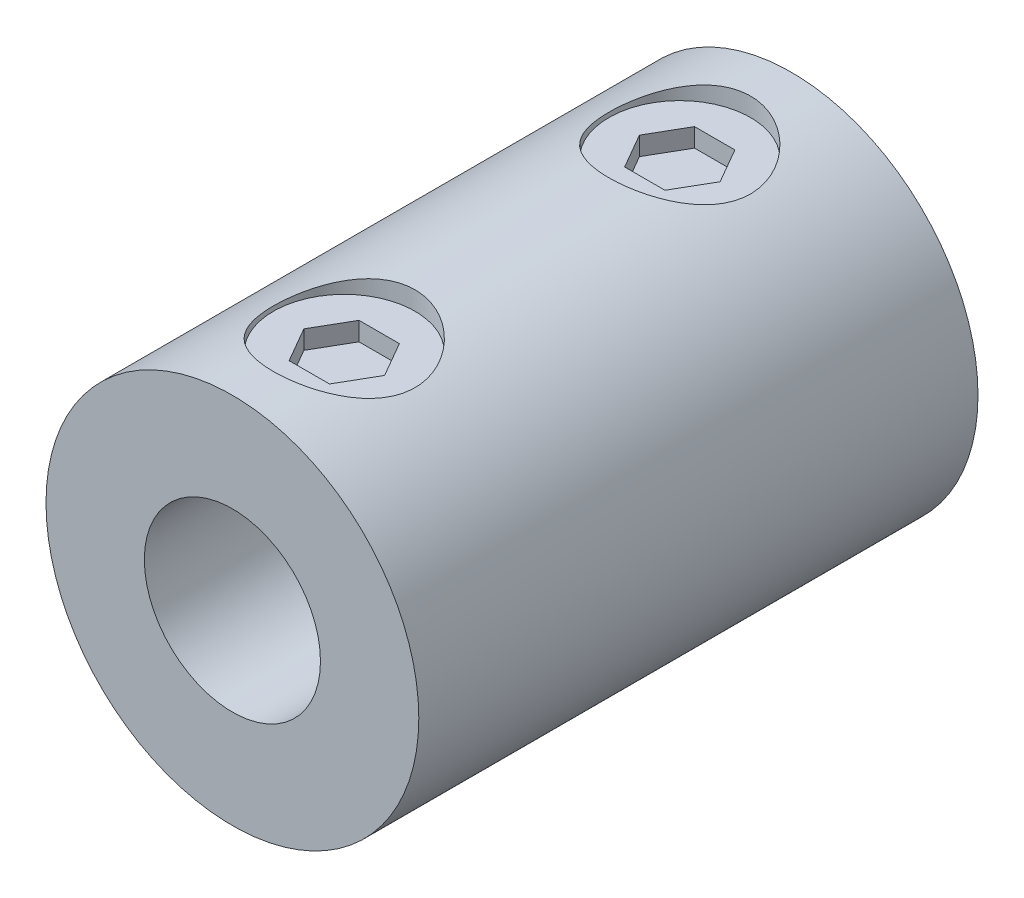
ISO-10303-21;
HEADER;
FILE_DESCRIPTION(('STEP AP214'),'2;1');
FILE_NAME('part.step','',(''),(''),'','','');
FILE_SCHEMA(('AUTOMOTIVE_DESIGN { 1 0 10303 214 1 1 1 1 }'));
ENDSEC;
DATA;
#1=APPLICATION_CONTEXT('core data for automotive mechanical design processes');
#2=APPLICATION_PROTOCOL_DEFINITION('international standard','automotive_design',2000,#1);
#3=PRODUCT_CONTEXT('',#1,'mechanical');
#4=PRODUCT('Part','Part','',(#3));
#5=PRODUCT_RELATED_PRODUCT_CATEGORY('part','',(#4));
#6=PRODUCT_DEFINITION_FORMATION('','',#4);
#7=PRODUCT_DEFINITION_CONTEXT('part definition',#1,'design');
#8=PRODUCT_DEFINITION('design','',#6,#7);
#9=PRODUCT_DEFINITION_SHAPE('','',#8);
#10=(LENGTH_UNIT() NAMED_UNIT(*) SI_UNIT(.MILLI.,.METRE.));
#11=(NAMED_UNIT(*) PLANE_ANGLE_UNIT() SI_UNIT($,.RADIAN.));
#12=(NAMED_UNIT(*) SI_UNIT($,.STERADIAN.) SOLID_ANGLE_UNIT());
#13=UNCERTAINTY_MEASURE_WITH_UNIT(LENGTH_MEASURE(1.E-05),#10,'distance_accuracy_value','');
#14=(GEOMETRIC_REPRESENTATION_CONTEXT(3) GLOBAL_UNCERTAINTY_ASSIGNED_CONTEXT((#13)) GLOBAL_UNIT_ASSIGNED_CONTEXT((#10,
#11,#12)) REPRESENTATION_CONTEXT('',''));
#15=CARTESIAN_POINT('',(0.,0.,0.));
#16=DIRECTION('',(0.,0.,1.));
#17=DIRECTION('',(1.,0.,0.));
#18=AXIS2_PLACEMENT_3D('',#15,#16,#17);
#19=CARTESIAN_POINT('',(0.,0.,0.));
#20=DIRECTION('',(0.,0.,1.));
#21=DIRECTION('',(1.,0.,0.));
#22=AXIS2_PLACEMENT_3D('',#19,#20,#21);
#23=CYLINDRICAL_SURFACE('',#22,6.35);
#24=CARTESIAN_POINT('',(0.,6.35,-1.397));
#25=CARTESIAN_POINT('',(-0.130555931467962,6.35000398969011,-1.39699472465397));
#26=CARTESIAN_POINT('',(-0.261076241377739,6.34593890816647,-1.40762854568869));
#27=CARTESIAN_POINT('',(-0.518209446534913,6.33012963929965,-1.44970520323576));
#28=CARTESIAN_POINT('',(-0.644823015088655,6.31838678300935,-1.48114443284222));
#29=CARTESIAN_POINT('',(-0.890396734122701,6.28848040494,-1.56355488397925));
#30=CARTESIAN_POINT('',(-1.00937135935963,6.27032947705095,-1.61448781061553));
#31=CARTESIAN_POINT('',(-1.23707694907279,6.22940932060409,-1.73424235438065));
#32=CARTESIAN_POINT('',(-1.34580507871092,6.20663881943741,-1.80306890235231));
#33=CARTESIAN_POINT('',(-1.55465440906211,6.15771932779737,-1.95977722907386));
#34=CARTESIAN_POINT('',(-1.65427192875035,6.13147296383124,-2.04829958375005));
#35=CARTESIAN_POINT('',(-1.83765571561736,6.07903240405007,-2.24052684957095));
#36=CARTESIAN_POINT('',(-1.92141693988139,6.05283822744466,-2.34423657234878));
#37=CARTESIAN_POINT('',(-2.07395660623912,6.00232668170519,-2.56886613529876));
#38=CARTESIAN_POINT('',(-2.14201618015845,5.97812365120729,-2.69030243845216));
#39=CARTESIAN_POINT('',(-2.25652093858858,5.93585432476053,-2.94396161956764));
#40=CARTESIAN_POINT('',(-2.30297502037546,5.91778550353544,-3.07618003097919));
#41=CARTESIAN_POINT('',(-2.37094947712185,5.89087364983883,-3.34184636810197));
#42=CARTESIAN_POINT('',(-2.39343294050412,5.88167580744491,-3.47501069920451));
#43=CARTESIAN_POINT('',(-2.41583880524757,5.87251090464605,-3.74351540370638));
#44=CARTESIAN_POINT('',(-2.41577084821779,5.87253989940926,-3.87885482242323));
#45=CARTESIAN_POINT('',(-2.39381090108878,5.88152011871453,-4.13897222700301));
#46=CARTESIAN_POINT('',(-2.37326609797153,5.88992057372023,-4.26388652256324));
#47=CARTESIAN_POINT('',(-2.31316652422954,5.91378008823147,-4.50833970499082));
#48=CARTESIAN_POINT('',(-2.27360881167116,5.92924024008996,-4.6278777568419));
#49=CARTESIAN_POINT('',(-2.17588364092748,5.96580146890692,-4.86089161528519));
#50=CARTESIAN_POINT('',(-2.11737290423755,5.98700531598431,-4.97420661484106));
#51=CARTESIAN_POINT('',(-1.98364217411329,6.03263175509447,-5.18979639920587));
#52=CARTESIAN_POINT('',(-1.90841630395244,6.05705547794376,-5.29206728227269));
#53=CARTESIAN_POINT('',(-1.73726689770536,6.10842961274997,-5.49010694238863));
#54=CARTESIAN_POINT('',(-1.64027173491613,6.13543795015635,-5.58493688260015));
#55=CARTESIAN_POINT('',(-1.43144868882472,6.18748920351012,-5.75726806056401));
#56=CARTESIAN_POINT('',(-1.31961840653187,6.2125318005324,-5.83476649017818));
#57=CARTESIAN_POINT('',(-1.08185265975391,6.25835188225341,-5.97130771487283));
#58=CARTESIAN_POINT('',(-0.955717417234619,6.27905339803369,-6.03002994310971));
#59=CARTESIAN_POINT('',(-0.694375189035109,6.31329326294077,-6.12510736575225));
#60=CARTESIAN_POINT('',(-0.559172376611222,6.32683488218724,-6.1614727723643));
#61=CARTESIAN_POINT('',(-0.291428150212526,6.3446501972992,-6.20898109857718));
#62=CARTESIAN_POINT('',(-0.159141645079809,6.34938771868047,-6.22138775288999));
#63=CARTESIAN_POINT('',(0.105693065348275,6.35049981057155,-6.22431626348442));
#64=CARTESIAN_POINT('',(0.238241203822051,6.34687629478166,-6.21484312768025));
#65=CARTESIAN_POINT('',(0.494323602805378,6.33197908606406,-6.17523562382545));
#66=CARTESIAN_POINT('',(0.61800684441211,6.32101461634214,-6.14593589818825));
#67=CARTESIAN_POINT('',(0.858609565436108,6.29285092848222,-6.06861304376362));
#68=CARTESIAN_POINT('',(0.975528163914414,6.27565090041604,-6.02058748264172));
#69=CARTESIAN_POINT('',(1.20317276582384,6.23607457125026,-5.90563503714011));
#70=CARTESIAN_POINT('',(1.3136121499673,6.21355984396609,-5.8381896761049));
#71=CARTESIAN_POINT('',(1.52197988578177,6.16583504517286,-5.68689595883598));
#72=CARTESIAN_POINT('',(1.61990351002366,6.14062396176678,-5.60304143465584));
#73=CARTESIAN_POINT('',(1.80656807112922,6.08841217199752,-5.41543272496061));
#74=CARTESIAN_POINT('',(1.89441393314817,6.06139435477813,-5.3107904098217));
#75=CARTESIAN_POINT('',(2.05148411432654,6.01005496187559,-5.08772800811267));
#76=CARTESIAN_POINT('',(2.12070651399853,5.98573366426972,-4.96930650314625));
#77=CARTESIAN_POINT('',(2.23870023772464,5.94261798623814,-4.7209227485386));
#78=CARTESIAN_POINT('',(2.28736466342468,5.92385264334907,-4.59090433202338));
#79=CARTESIAN_POINT('',(2.36177800946808,5.89458517077402,-4.32360269433198));
#80=CARTESIAN_POINT('',(2.38754162954713,5.8840777409413,-4.18632419336358));
#81=CARTESIAN_POINT('',(2.41408994040532,5.87323215610138,-3.91812716521538));
#82=CARTESIAN_POINT('',(2.41640623148607,5.87227054588007,-3.78738426561589));
#83=CARTESIAN_POINT('',(2.3999373204655,5.8790202253426,-3.52747512660344));
#84=CARTESIAN_POINT('',(2.38115423316032,5.88673064582665,-3.39830873048875));
#85=CARTESIAN_POINT('',(2.32422421188573,5.90943043237583,-3.14944773415065));
#86=CARTESIAN_POINT('',(2.28672002796391,5.92417751295514,-3.02958208050832));
#87=CARTESIAN_POINT('',(2.193985281894,5.95914188552999,-2.79777854381398));
#88=CARTESIAN_POINT('',(2.13875018285588,5.97936057736355,-2.68584269875618));
#89=CARTESIAN_POINT('',(2.00869997639504,6.02433337271119,-2.46657199424197));
#90=CARTESIAN_POINT('',(1.93299650808672,6.04927206356278,-2.3598023758283));
#91=CARTESIAN_POINT('',(1.76551836882646,6.10025417003155,-2.15999380632773));
#92=CARTESIAN_POINT('',(1.67373852090438,6.12629793945648,-2.06695929610574));
#93=CARTESIAN_POINT('',(1.47055494697206,6.17831294001547,-1.89192790048063));
#94=CARTESIAN_POINT('',(1.35833856072122,6.20419794006484,-1.81084443358628));
#95=CARTESIAN_POINT('',(1.12096041375387,6.25144642675378,-1.66870237925231));
#96=CARTESIAN_POINT('',(0.995797050693126,6.27280935273315,-1.60764627434948));
#97=CARTESIAN_POINT('',(0.728778395788013,6.30955475572144,-1.50500736383774));
#98=CARTESIAN_POINT('',(0.586384697783372,6.32454657619378,-1.4646711947635));
#99=CARTESIAN_POINT('',(0.295976705251579,6.34476431329028,-1.41067767117735));
#100=CARTESIAN_POINT('',(0.147965475024478,6.34999547828747,-1.39700597880979));
#101=CARTESIAN_POINT('',(0.,6.35,-1.397));
#102=B_SPLINE_CURVE_WITH_KNOTS('',3,(#24,#25,#26,#27,#28,#29,#30,#31,#32,#33,#34,#35,#36,#37,
#38,#39,#40,#41,#42,#43,#44,#45,#46,#47,#48,#49,#50,#51,#52,#53,#54,#55,#56,#57,#58,#59,#60,#61,
#62,#63,#64,#65,#66,#67,#68,#69,#70,#71,#72,#73,#74,#75,#76,#77,#78,#79,#80,#81,#82,#83,#84,#85,
#86,#87,#88,#89,#90,#91,#92,#93,#94,#95,#96,#97,#98,#99,#100,#101),.UNSPECIFIED.,.T.,.F.,(4,2,2,
2,2,2,2,2,2,2,2,2,2,2,2,2,2,2,2,2,2,2,2,2,2,2,2,2,2,2,2,2,2,2,2,2,2,2,4),(0.,0.391121887064184,
0.782175985486185,1.17246577830223,1.56286323524963,1.96854634212709,2.37435825594016,
2.79613130529395,3.21773051175688,3.62166628723491,4.02542936468621,4.40427313209371,
4.78317553819666,5.16936515238192,5.55569075901495,5.96873424705113,6.38184461005431,
6.80167192308662,7.22130732355893,7.61812936188613,8.01486058335589,8.39585156202365,
8.77689204483065,9.16923685275,9.56172942118013,9.9776135359701,10.3935404987953,
10.8116043631128,11.2293996833676,11.6197130905881,12.0099873800853,12.3876994067832,
12.7655081575183,13.1635000328781,13.5616203073396,13.9821012344605,14.4026342635628,
14.8461505355472,15.2894282569131),.UNSPECIFIED.);
#103=CARTESIAN_POINT('',(0.,6.35,-1.397));
#104=VERTEX_POINT('',#103);
#105=EDGE_CURVE('E251',#104,#104,#102,.T.);
#106=ORIENTED_EDGE('',*,*,#105,.T.);
#107=EDGE_LOOP('',(#106));
#108=FACE_BOUND('',#107,.T.);
#109=CARTESIAN_POINT('',(0.,0.,0.));
#110=DIRECTION('',(0.,0.,1.));
#111=DIRECTION('',(1.,0.,0.));
#112=AXIS2_PLACEMENT_3D('',#109,#110,#111);
#113=CIRCLE('',#112,6.35);
#114=CARTESIAN_POINT('',(6.35,0.,0.));
#115=VERTEX_POINT('',#114);
#116=EDGE_CURVE('E245',#115,#115,#113,.T.);
#117=ORIENTED_EDGE('',*,*,#116,.F.);
#118=EDGE_LOOP('',(#117));
#119=FACE_BOUND('',#118,.T.);
#120=CARTESIAN_POINT('',(0.,0.,-19.05));
#121=DIRECTION('',(0.,0.,1.));
#122=DIRECTION('',(1.,0.,0.));
#123=AXIS2_PLACEMENT_3D('',#120,#121,#122);
#124=CIRCLE('',#123,6.35);
#125=CARTESIAN_POINT('',(6.35,0.,-19.05));
#126=VERTEX_POINT('',#125);
#127=EDGE_CURVE('E242',#126,#126,#124,.T.);
#128=ORIENTED_EDGE('',*,*,#127,.T.);
#129=EDGE_LOOP('',(#128));
#130=FACE_BOUND('',#129,.T.);
#131=CARTESIAN_POINT('',(0.,6.35,-12.827));
#132=CARTESIAN_POINT('',(0.130555931467962,6.35000398969011,-12.826994724654));
#133=CARTESIAN_POINT('',(0.261076241377739,6.34593890816647,-12.8376285456887));
#134=CARTESIAN_POINT('',(0.518209446534913,6.33012963929965,-12.8797052032358));
#135=CARTESIAN_POINT('',(0.644823015088655,6.31838678300935,-12.9111444328422));
#136=CARTESIAN_POINT('',(0.890396734122701,6.28848040494,-12.9935548839793));
#137=CARTESIAN_POINT('',(1.00937135935963,6.27032947705095,-13.0444878106155));
#138=CARTESIAN_POINT('',(1.23707694907279,6.22940932060409,-13.1642423543807));
#139=CARTESIAN_POINT('',(1.34580507871092,6.20663881943741,-13.2330689023523));
#140=CARTESIAN_POINT('',(1.55465440906211,6.15771932779737,-13.3897772290739));
#141=CARTESIAN_POINT('',(1.65427192875035,6.13147296383124,-13.4782995837501));
#142=CARTESIAN_POINT('',(1.83765571561736,6.07903240405007,-13.670526849571));
#143=CARTESIAN_POINT('',(1.92141693988139,6.05283822744466,-13.7742365723488));
#144=CARTESIAN_POINT('',(2.07395660623911,6.00232668170519,-13.9988661352988));
#145=CARTESIAN_POINT('',(2.14201618015845,5.97812365120729,-14.1203024384522));
#146=CARTESIAN_POINT('',(2.25652093858858,5.93585432476053,-14.3739616195676));
#147=CARTESIAN_POINT('',(2.30297502037546,5.91778550353544,-14.5061800309792));
#148=CARTESIAN_POINT('',(2.37094947712185,5.89087364983883,-14.771846368102));
#149=CARTESIAN_POINT('',(2.39343294050412,5.88167580744491,-14.9050106992045));
#150=CARTESIAN_POINT('',(2.41583880524757,5.87251090464605,-15.1735154037064));
#151=CARTESIAN_POINT('',(2.41577084821779,5.87253989940926,-15.3088548224232));
#152=CARTESIAN_POINT('',(2.39381090108878,5.88152011871453,-15.568972227003));
#153=CARTESIAN_POINT('',(2.37326609797153,5.88992057372023,-15.6938865225632));
#154=CARTESIAN_POINT('',(2.31316652422954,5.91378008823147,-15.9383397049908));
#155=CARTESIAN_POINT('',(2.27360881167116,5.92924024008996,-16.0578777568419));
#156=CARTESIAN_POINT('',(2.17588364092748,5.96580146890692,-16.2908916152852));
#157=CARTESIAN_POINT('',(2.11737290423754,5.98700531598431,-16.4042066148411));
#158=CARTESIAN_POINT('',(1.98364217411328,6.03263175509448,-16.6197963992059));
#159=CARTESIAN_POINT('',(1.90841630395244,6.05705547794376,-16.7220672822727));
#160=CARTESIAN_POINT('',(1.73726689770536,6.10842961274997,-16.9201069423886));
#161=CARTESIAN_POINT('',(1.64027173491613,6.13543795015635,-17.0149368826002));
#162=CARTESIAN_POINT('',(1.43144868882472,6.18748920351011,-17.187268060564));
#163=CARTESIAN_POINT('',(1.31961840653187,6.2125318005324,-17.2647664901782));
#164=CARTESIAN_POINT('',(1.08185265975391,6.25835188225341,-17.4013077148728));
#165=CARTESIAN_POINT('',(0.95571741723462,6.27905339803369,-17.4600299431097));
#166=CARTESIAN_POINT('',(0.69437518903511,6.31329326294077,-17.5551073657523));
#167=CARTESIAN_POINT('',(0.559172376611222,6.32683488218724,-17.5914727723643));
#168=CARTESIAN_POINT('',(0.291428150212526,6.3446501972992,-17.6389810985772));
#169=CARTESIAN_POINT('',(0.159141645079809,6.34938771868047,-17.65138775289));
#170=CARTESIAN_POINT('',(-0.105693065348275,6.35049981057155,-17.6543162634844));
#171=CARTESIAN_POINT('',(-0.238241203822051,6.34687629478166,-17.6448431276803));
#172=CARTESIAN_POINT('',(-0.494323602805378,6.33197908606406,-17.6052356238255));
#173=CARTESIAN_POINT('',(-0.61800684441211,6.32101461634214,-17.5759358981883));
#174=CARTESIAN_POINT('',(-0.858609565436108,6.29285092848222,-17.4986130437636));
#175=CARTESIAN_POINT('',(-0.975528163914414,6.27565090041604,-17.4505874826417));
#176=CARTESIAN_POINT('',(-1.20317276582384,6.23607457125026,-17.3356350371401));
#177=CARTESIAN_POINT('',(-1.3136121499673,6.21355984396609,-17.2681896761049));
#178=CARTESIAN_POINT('',(-1.52197988578177,6.16583504517286,-17.116895958836));
#179=CARTESIAN_POINT('',(-1.61990351002366,6.14062396176678,-17.0330414346558));
#180=CARTESIAN_POINT('',(-1.80656807112922,6.08841217199752,-16.8454327249606));
#181=CARTESIAN_POINT('',(-1.89441393314817,6.06139435477813,-16.7407904098217));
#182=CARTESIAN_POINT('',(-2.05148411432654,6.01005496187559,-16.5177280081127));
#183=CARTESIAN_POINT('',(-2.12070651399853,5.98573366426972,-16.3993065031462));
#184=CARTESIAN_POINT('',(-2.23870023772464,5.94261798623814,-16.1509227485386));
#185=CARTESIAN_POINT('',(-2.28736466342468,5.92385264334907,-16.0209043320234));
#186=CARTESIAN_POINT('',(-2.36177800946809,5.89458517077402,-15.753602694332));
#187=CARTESIAN_POINT('',(-2.38754162954713,5.8840777409413,-15.6163241933636));
#188=CARTESIAN_POINT('',(-2.41408994040532,5.87323215610138,-15.3481271652154));
#189=CARTESIAN_POINT('',(-2.41640623148607,5.87227054588007,-15.2173842656159));
#190=CARTESIAN_POINT('',(-2.3999373204655,5.8790202253426,-14.9574751266034));
#191=CARTESIAN_POINT('',(-2.38115423316032,5.88673064582665,-14.8283087304887));
#192=CARTESIAN_POINT('',(-2.32422421188573,5.90943043237583,-14.5794477341507));
#193=CARTESIAN_POINT('',(-2.28672002796391,5.92417751295514,-14.4595820805083));
#194=CARTESIAN_POINT('',(-2.19398528189399,5.95914188552999,-14.227778543814));
#195=CARTESIAN_POINT('',(-2.13875018285588,5.97936057736356,-14.1158426987562));
#196=CARTESIAN_POINT('',(-2.00869997639504,6.02433337271119,-13.896571994242));
#197=CARTESIAN_POINT('',(-1.93299650808671,6.04927206356278,-13.7898023758283));
#198=CARTESIAN_POINT('',(-1.76551836882646,6.10025417003155,-13.5899938063277));
#199=CARTESIAN_POINT('',(-1.67373852090438,6.12629793945648,-13.4969592961057));
#200=CARTESIAN_POINT('',(-1.47055494697206,6.17831294001547,-13.3219279004806));
#201=CARTESIAN_POINT('',(-1.35833856072122,6.20419794006484,-13.2408444335863));
#202=CARTESIAN_POINT('',(-1.12096041375387,6.25144642675378,-13.0987023792523));
#203=CARTESIAN_POINT('',(-0.995797050693125,6.27280935273315,-13.0376462743495));
#204=CARTESIAN_POINT('',(-0.728778395788011,6.30955475572144,-12.9350073638377));
#205=CARTESIAN_POINT('',(-0.58638469778337,6.32454657619378,-12.8946711947635));
#206=CARTESIAN_POINT('',(-0.295976705251577,6.34476431329028,-12.8406776711774));
#207=CARTESIAN_POINT('',(-0.147965475024477,6.34999547828747,-12.8270059788098));
#208=CARTESIAN_POINT('',(0.,6.35,-12.827));
#209=B_SPLINE_CURVE_WITH_KNOTS('',3,(#131,#132,#133,#134,#135,#136,#137,#138,#139,#140,#141,
#142,#143,#144,#145,#146,#147,#148,#149,#150,#151,#152,#153,#154,#155,#156,#157,#158,#159,#160,
#161,#162,#163,#164,#165,#166,#167,#168,#169,#170,#171,#172,#173,#174,#175,#176,#177,#178,#179,
#180,#181,#182,#183,#184,#185,#186,#187,#188,#189,#190,#191,#192,#193,#194,#195,#196,#197,#198,
#199,#200,#201,#202,#203,#204,#205,#206,#207,#208),.UNSPECIFIED.,.T.,.F.,(4,2,2,2,2,2,2,2,2,2,2,
2,2,2,2,2,2,2,2,2,2,2,2,2,2,2,2,2,2,2,2,2,2,2,2,2,2,2,4),(0.,0.391121887064184,
0.782175985486185,1.17246577830223,1.56286323524963,1.96854634212709,2.37435825594016,
2.79613130529395,3.21773051175688,3.62166628723491,4.02542936468621,4.40427313209371,
4.78317553819666,5.16936515238193,5.55569075901495,5.96873424705112,6.38184461005431,
6.80167192308661,7.22130732355893,7.61812936188612,8.01486058335589,8.39585156202364,
8.77689204483065,9.16923685275,9.56172942118013,9.9776135359701,10.3935404987953,
10.8116043631128,11.2293996833676,11.6197130905881,12.0099873800853,12.3876994067832,
12.7655081575183,13.1635000328781,13.5616203073396,13.9821012344605,14.4026342635628,
14.8461505355472,15.2894282569131),.UNSPECIFIED.);
#210=CARTESIAN_POINT('',(0.,6.35,-12.827));
#211=VERTEX_POINT('',#210);
#212=EDGE_CURVE('E51',#211,#211,#209,.T.);
#213=ORIENTED_EDGE('',*,*,#212,.F.);
#214=EDGE_LOOP('',(#213));
#215=FACE_BOUND('',#214,.T.);
#216=ADVANCED_FACE('F43',(#108,#119,#130,#215),#23,.T.);
#217=CARTESIAN_POINT('',(0.,0.,0.));
#218=DIRECTION('',(0.,0.,1.));
#219=DIRECTION('',(1.,0.,0.));
#220=AXIS2_PLACEMENT_3D('',#217,#218,#219);
#221=CYLINDRICAL_SURFACE('',#220,3.);
#222=CARTESIAN_POINT('',(0.,0.,-9.525));
#223=DIRECTION('',(0.,0.,1.));
#224=DIRECTION('',(1.,0.,0.));
#225=AXIS2_PLACEMENT_3D('',#222,#223,#224);
#226=CIRCLE('',#225,3.);
#227=CARTESIAN_POINT('',(3.,0.,-9.525));
#228=VERTEX_POINT('',#227);
#229=EDGE_CURVE('E233',#228,#228,#226,.T.);
#230=ORIENTED_EDGE('',*,*,#229,.F.);
#231=EDGE_LOOP('',(#230));
#232=FACE_BOUND('',#231,.T.);
#233=CARTESIAN_POINT('',(0.,0.,0.));
#234=DIRECTION('',(0.,0.,1.));
#235=DIRECTION('',(1.,0.,0.));
#236=AXIS2_PLACEMENT_3D('',#233,#234,#235);
#237=CIRCLE('',#236,3.);
#238=CARTESIAN_POINT('',(3.,0.,0.));
#239=VERTEX_POINT('',#238);
#240=EDGE_CURVE('E248',#239,#239,#237,.T.);
#241=ORIENTED_EDGE('',*,*,#240,.T.);
#242=EDGE_LOOP('',(#241));
#243=FACE_BOUND('',#242,.T.);
#244=ADVANCED_FACE('F45',(#232,#243),#221,.F.);
#245=CARTESIAN_POINT('',(0.,3.,0.));
#246=DIRECTION('',(0.,0.,-1.));
#247=DIRECTION('',(-1.,0.,0.));
#248=AXIS2_PLACEMENT_3D('',#245,#246,#247);
#249=PLANE('',#248);
#250=ORIENTED_EDGE('',*,*,#240,.F.);
#251=EDGE_LOOP('',(#250));
#252=FACE_BOUND('',#251,.T.);
#253=ORIENTED_EDGE('',*,*,#116,.T.);
#254=EDGE_LOOP('',(#253));
#255=FACE_BOUND('',#254,.T.);
#256=ADVANCED_FACE('F282',(#252,#255),#249,.F.);
#257=CARTESIAN_POINT('',(0.,6.35,-19.05));
#258=DIRECTION('',(0.,0.,1.));
#259=DIRECTION('',(1.,0.,0.));
#260=AXIS2_PLACEMENT_3D('',#257,#258,#259);
#261=PLANE('',#260);
#262=ORIENTED_EDGE('',*,*,#127,.F.);
#263=EDGE_LOOP('',(#262));
#264=FACE_BOUND('',#263,.T.);
#265=CARTESIAN_POINT('',(0.,0.,-19.05));
#266=DIRECTION('',(0.,0.,1.));
#267=DIRECTION('',(1.,0.,0.));
#268=AXIS2_PLACEMENT_3D('',#265,#266,#267);
#269=CIRCLE('',#268,3.96875);
#270=CARTESIAN_POINT('',(3.96875,0.,-19.05));
#271=VERTEX_POINT('',#270);
#272=EDGE_CURVE('E239',#271,#271,#269,.T.);
#273=ORIENTED_EDGE('',*,*,#272,.T.);
#274=EDGE_LOOP('',(#273));
#275=FACE_BOUND('',#274,.T.);
#276=ADVANCED_FACE('F279',(#264,#275),#261,.F.);
#277=CARTESIAN_POINT('',(0.,0.,0.));
#278=DIRECTION('',(0.,0.,1.));
#279=DIRECTION('',(1.,0.,0.));
#280=AXIS2_PLACEMENT_3D('',#277,#278,#279);
#281=CYLINDRICAL_SURFACE('',#280,3.96875);
#282=ORIENTED_EDGE('',*,*,#272,.F.);
#283=EDGE_LOOP('',(#282));
#284=FACE_BOUND('',#283,.T.);
#285=CARTESIAN_POINT('',(0.,0.,-9.525));
#286=DIRECTION('',(0.,0.,1.));
#287=DIRECTION('',(1.,0.,0.));
#288=AXIS2_PLACEMENT_3D('',#285,#286,#287);
#289=CIRCLE('',#288,3.96875);
#290=CARTESIAN_POINT('',(3.96875,0.,-9.525));
#291=VERTEX_POINT('',#290);
#292=EDGE_CURVE('E236',#291,#291,#289,.T.);
#293=ORIENTED_EDGE('',*,*,#292,.T.);
#294=EDGE_LOOP('',(#293));
#295=FACE_BOUND('',#294,.T.);
#296=ADVANCED_FACE('F276',(#284,#295),#281,.F.);
#297=CARTESIAN_POINT('',(0.,3.96875,-9.525));
#298=DIRECTION('',(0.,0.,1.));
#299=DIRECTION('',(1.,0.,0.));
#300=AXIS2_PLACEMENT_3D('',#297,#298,#299);
#301=PLANE('',#300);
#302=ORIENTED_EDGE('',*,*,#292,.F.);
#303=EDGE_LOOP('',(#302));
#304=FACE_BOUND('',#303,.T.);
#305=ORIENTED_EDGE('',*,*,#229,.T.);
#306=EDGE_LOOP('',(#305));
#307=FACE_BOUND('',#306,.T.);
#308=ADVANCED_FACE('F270',(#304,#307),#301,.F.);
#309=CARTESIAN_POINT('',(0.,5.08,-3.81));
#310=DIRECTION('',(0.,1.,0.));
#311=DIRECTION('',(0.,0.,1.));
#312=AXIS2_PLACEMENT_3D('',#309,#310,#311);
#313=CYLINDRICAL_SURFACE('',#312,2.413);
#314=CARTESIAN_POINT('',(0.,5.715,-3.81));
#315=DIRECTION('',(0.,1.,0.));
#316=DIRECTION('',(0.,0.,1.));
#317=AXIS2_PLACEMENT_3D('',#314,#315,#316);
#318=CIRCLE('',#317,2.413);
#319=CARTESIAN_POINT('',(0.,5.715,-1.397));
#320=VERTEX_POINT('',#319);
#321=EDGE_CURVE('E230',#320,#320,#318,.T.);
#322=ORIENTED_EDGE('',*,*,#321,.F.);
#323=EDGE_LOOP('',(#322));
#324=FACE_BOUND('',#323,.T.);
#325=ORIENTED_EDGE('',*,*,#105,.F.);
#326=EDGE_LOOP('',(#325));
#327=FACE_BOUND('',#326,.T.);
#328=ADVANCED_FACE('F264',(#324,#327),#313,.F.);
#329=CARTESIAN_POINT('',(0.,5.715,-3.81));
#330=DIRECTION('',(0.,1.,0.));
#331=DIRECTION('',(0.,0.,1.));
#332=AXIS2_PLACEMENT_3D('',#329,#330,#331);
#333=PLANE('',#332);
#334=ORIENTED_EDGE('',*,*,#321,.T.);
#335=EDGE_LOOP('',(#334));
#336=FACE_BOUND('',#335,.T.);
#337=DIRECTION('',(-0.5,0.,-0.866025403784439));
#338=VECTOR('',#337,1.);
#339=CARTESIAN_POINT('',(1.3748153285078,5.715,-3.81));
#340=LINE('',#339,#338);
#341=CARTESIAN_POINT('',(1.3748153285078,5.715,-3.81));
#342=VERTEX_POINT('',#341);
#343=CARTESIAN_POINT('',(0.687407664253897,5.715,-5.000625));
#344=VERTEX_POINT('',#343);
#345=EDGE_CURVE('E190',#342,#344,#340,.T.);
#346=ORIENTED_EDGE('',*,*,#345,.F.);
#347=DIRECTION('',(0.5,0.,-0.866025403784439));
#348=VECTOR('',#347,1.);
#349=CARTESIAN_POINT('',(0.687407664253897,5.715,-2.619375));
#350=LINE('',#349,#348);
#351=CARTESIAN_POINT('',(0.687407664253897,5.715,-2.619375));
#352=VERTEX_POINT('',#351);
#353=EDGE_CURVE('E188',#352,#342,#350,.T.);
#354=ORIENTED_EDGE('',*,*,#353,.F.);
#355=DIRECTION('',(1.,0.,0.));
#356=VECTOR('',#355,1.);
#357=CARTESIAN_POINT('',(-0.687407664253899,5.715,-2.619375));
#358=LINE('',#357,#356);
#359=CARTESIAN_POINT('',(-0.687407664253899,5.715,-2.619375));
#360=VERTEX_POINT('',#359);
#361=EDGE_CURVE('E200',#360,#352,#358,.T.);
#362=ORIENTED_EDGE('',*,*,#361,.F.);
#363=DIRECTION('',(0.5,0.,0.866025403784439));
#364=VECTOR('',#363,1.);
#365=CARTESIAN_POINT('',(-1.3748153285078,5.715,-3.81));
#366=LINE('',#365,#364);
#367=CARTESIAN_POINT('',(-1.3748153285078,5.715,-3.81));
#368=VERTEX_POINT('',#367);
#369=EDGE_CURVE('E197',#368,#360,#366,.T.);
#370=ORIENTED_EDGE('',*,*,#369,.F.);
#371=DIRECTION('',(-0.5,0.,0.866025403784439));
#372=VECTOR('',#371,1.);
#373=CARTESIAN_POINT('',(-0.687407664253898,5.715,-5.000625));
#374=LINE('',#373,#372);
#375=CARTESIAN_POINT('',(-0.687407664253898,5.715,-5.000625));
#376=VERTEX_POINT('',#375);
#377=EDGE_CURVE('E195',#376,#368,#374,.T.);
#378=ORIENTED_EDGE('',*,*,#377,.F.);
#379=DIRECTION('',(-1.,0.,0.));
#380=VECTOR('',#379,1.);
#381=CARTESIAN_POINT('',(0.687407664253897,5.715,-5.000625));
#382=LINE('',#381,#380);
#383=EDGE_CURVE('E193',#344,#376,#382,.T.);
#384=ORIENTED_EDGE('',*,*,#383,.F.);
#385=EDGE_LOOP('',(#346,#354,#362,#370,#378,#384));
#386=FACE_BOUND('',#385,.T.);
#387=ADVANCED_FACE('F269',(#336,#386),#333,.T.);
#388=CARTESIAN_POINT('',(0.687407664253897,5.715,-2.619375));
#389=DIRECTION('',(-0.866025403784439,0.,-0.5));
#390=DIRECTION('',(-0.5,0.,0.866025403784439));
#391=AXIS2_PLACEMENT_3D('',#388,#389,#390);
#392=PLANE('',#391);
#393=DIRECTION('',(0.5,0.,-0.866025403784439));
#394=VECTOR('',#393,1.);
#395=CARTESIAN_POINT('',(0.687407664253897,5.08,-2.619375));
#396=LINE('',#395,#394);
#397=CARTESIAN_POINT('',(0.687407664253897,5.08,-2.619375));
#398=VERTEX_POINT('',#397);
#399=CARTESIAN_POINT('',(1.3748153285078,5.08,-3.81));
#400=VERTEX_POINT('',#399);
#401=EDGE_CURVE('E66',#398,#400,#396,.T.);
#402=ORIENTED_EDGE('',*,*,#401,.F.);
#403=DIRECTION('',(0.,-1.,0.));
#404=VECTOR('',#403,1.);
#405=CARTESIAN_POINT('',(0.687407664253897,5.715,-2.619375));
#406=LINE('',#405,#404);
#407=EDGE_CURVE('E202',#352,#398,#406,.T.);
#408=ORIENTED_EDGE('',*,*,#407,.F.);
#409=ORIENTED_EDGE('',*,*,#353,.T.);
#410=DIRECTION('',(0.,-1.,0.));
#411=VECTOR('',#410,1.);
#412=CARTESIAN_POINT('',(1.3748153285078,5.715,-3.81));
#413=LINE('',#412,#411);
#414=EDGE_CURVE('E227',#342,#400,#413,.T.);
#415=ORIENTED_EDGE('',*,*,#414,.T.);
#416=EDGE_LOOP('',(#402,#408,#409,#415));
#417=FACE_BOUND('',#416,.T.);
#418=ADVANCED_FACE('F336',(#417),#392,.T.);
#419=CARTESIAN_POINT('',(1.3748153285078,5.715,-3.81));
#420=DIRECTION('',(-0.866025403784439,0.,0.5));
#421=DIRECTION('',(0.5,0.,0.866025403784439));
#422=AXIS2_PLACEMENT_3D('',#419,#420,#421);
#423=PLANE('',#422);
#424=DIRECTION('',(-0.5,0.,-0.866025403784439));
#425=VECTOR('',#424,1.);
#426=CARTESIAN_POINT('',(1.3748153285078,5.08,-3.81));
#427=LINE('',#426,#425);
#428=CARTESIAN_POINT('',(0.687407664253897,5.08,-5.000625));
#429=VERTEX_POINT('',#428);
#430=EDGE_CURVE('E204',#400,#429,#427,.T.);
#431=ORIENTED_EDGE('',*,*,#430,.F.);
#432=ORIENTED_EDGE('',*,*,#414,.F.);
#433=ORIENTED_EDGE('',*,*,#345,.T.);
#434=DIRECTION('',(0.,-1.,0.));
#435=VECTOR('',#434,1.);
#436=CARTESIAN_POINT('',(0.687407664253897,5.715,-5.000625));
#437=LINE('',#436,#435);
#438=EDGE_CURVE('E224',#344,#429,#437,.T.);
#439=ORIENTED_EDGE('',*,*,#438,.T.);
#440=EDGE_LOOP('',(#431,#432,#433,#439));
#441=FACE_BOUND('',#440,.T.);
#442=ADVANCED_FACE('F332',(#441),#423,.T.);
#443=CARTESIAN_POINT('',(0.687407664253897,5.715,-5.000625));
#444=DIRECTION('',(0.,0.,1.));
#445=DIRECTION('',(1.,0.,0.));
#446=AXIS2_PLACEMENT_3D('',#443,#444,#445);
#447=PLANE('',#446);
#448=DIRECTION('',(-1.,0.,0.));
#449=VECTOR('',#448,1.);
#450=CARTESIAN_POINT('',(0.687407664253897,5.08,-5.000625));
#451=LINE('',#450,#449);
#452=CARTESIAN_POINT('',(-0.687407664253899,5.08,-5.000625));
#453=VERTEX_POINT('',#452);
#454=EDGE_CURVE('E206',#429,#453,#451,.T.);
#455=ORIENTED_EDGE('',*,*,#454,.F.);
#456=ORIENTED_EDGE('',*,*,#438,.F.);
#457=ORIENTED_EDGE('',*,*,#383,.T.);
#458=DIRECTION('',(0.,-1.,0.));
#459=VECTOR('',#458,1.);
#460=CARTESIAN_POINT('',(-0.687407664253898,5.715,-5.000625));
#461=LINE('',#460,#459);
#462=EDGE_CURVE('E221',#376,#453,#461,.T.);
#463=ORIENTED_EDGE('',*,*,#462,.T.);
#464=EDGE_LOOP('',(#455,#456,#457,#463));
#465=FACE_BOUND('',#464,.T.);
#466=ADVANCED_FACE('F328',(#465),#447,.T.);
#467=CARTESIAN_POINT('',(-0.687407664253898,5.715,-5.000625));
#468=DIRECTION('',(0.866025403784439,0.,0.5));
#469=DIRECTION('',(0.5,0.,-0.866025403784439));
#470=AXIS2_PLACEMENT_3D('',#467,#468,#469);
#471=PLANE('',#470);
#472=DIRECTION('',(-0.5,0.,0.866025403784439));
#473=VECTOR('',#472,1.);
#474=CARTESIAN_POINT('',(-0.687407664253898,5.08,-5.000625));
#475=LINE('',#474,#473);
#476=CARTESIAN_POINT('',(-1.3748153285078,5.08,-3.81));
#477=VERTEX_POINT('',#476);
#478=EDGE_CURVE('E208',#453,#477,#475,.T.);
#479=ORIENTED_EDGE('',*,*,#478,.F.);
#480=ORIENTED_EDGE('',*,*,#462,.F.);
#481=ORIENTED_EDGE('',*,*,#377,.T.);
#482=DIRECTION('',(0.,-1.,0.));
#483=VECTOR('',#482,1.);
#484=CARTESIAN_POINT('',(-1.3748153285078,5.715,-3.81));
#485=LINE('',#484,#483);
#486=EDGE_CURVE('E218',#368,#477,#485,.T.);
#487=ORIENTED_EDGE('',*,*,#486,.T.);
#488=EDGE_LOOP('',(#479,#480,#481,#487));
#489=FACE_BOUND('',#488,.T.);
#490=ADVANCED_FACE('F324',(#489),#471,.T.);
#491=CARTESIAN_POINT('',(-1.3748153285078,5.715,-3.81));
#492=DIRECTION('',(0.866025403784439,0.,-0.5));
#493=DIRECTION('',(-0.5,0.,-0.866025403784439));
#494=AXIS2_PLACEMENT_3D('',#491,#492,#493);
#495=PLANE('',#494);
#496=DIRECTION('',(0.5,0.,0.866025403784439));
#497=VECTOR('',#496,1.);
#498=CARTESIAN_POINT('',(-1.3748153285078,5.08,-3.81));
#499=LINE('',#498,#497);
#500=CARTESIAN_POINT('',(-0.687407664253899,5.08,-2.619375));
#501=VERTEX_POINT('',#500);
#502=EDGE_CURVE('E210',#477,#501,#499,.T.);
#503=ORIENTED_EDGE('',*,*,#502,.F.);
#504=ORIENTED_EDGE('',*,*,#486,.F.);
#505=ORIENTED_EDGE('',*,*,#369,.T.);
#506=DIRECTION('',(0.,-1.,0.));
#507=VECTOR('',#506,1.);
#508=CARTESIAN_POINT('',(-0.687407664253899,5.715,-2.619375));
#509=LINE('',#508,#507);
#510=EDGE_CURVE('E215',#360,#501,#509,.T.);
#511=ORIENTED_EDGE('',*,*,#510,.T.);
#512=EDGE_LOOP('',(#503,#504,#505,#511));
#513=FACE_BOUND('',#512,.T.);
#514=ADVANCED_FACE('F320',(#513),#495,.T.);
#515=CARTESIAN_POINT('',(-0.687407664253899,5.715,-2.619375));
#516=DIRECTION('',(0.,0.,-1.));
#517=DIRECTION('',(-1.,0.,0.));
#518=AXIS2_PLACEMENT_3D('',#515,#516,#517);
#519=PLANE('',#518);
#520=DIRECTION('',(1.,0.,0.));
#521=VECTOR('',#520,1.);
#522=CARTESIAN_POINT('',(-0.687407664253899,5.08,-2.619375));
#523=LINE('',#522,#521);
#524=EDGE_CURVE('E191',#501,#398,#523,.T.);
#525=ORIENTED_EDGE('',*,*,#524,.F.);
#526=ORIENTED_EDGE('',*,*,#510,.F.);
#527=ORIENTED_EDGE('',*,*,#361,.T.);
#528=ORIENTED_EDGE('',*,*,#407,.T.);
#529=EDGE_LOOP('',(#525,#526,#527,#528));
#530=FACE_BOUND('',#529,.T.);
#531=ADVANCED_FACE('F312',(#530),#519,.T.);
#532=CARTESIAN_POINT('',(0.,5.08,-3.81));
#533=DIRECTION('',(0.,1.,0.));
#534=DIRECTION('',(0.,0.,1.));
#535=AXIS2_PLACEMENT_3D('',#532,#533,#534);
#536=PLANE('',#535);
#537=ORIENTED_EDGE('',*,*,#401,.T.);
#538=ORIENTED_EDGE('',*,*,#430,.T.);
#539=ORIENTED_EDGE('',*,*,#454,.T.);
#540=ORIENTED_EDGE('',*,*,#478,.T.);
#541=ORIENTED_EDGE('',*,*,#502,.T.);
#542=ORIENTED_EDGE('',*,*,#524,.T.);
#543=EDGE_LOOP('',(#537,#538,#539,#540,#541,#542));
#544=FACE_BOUND('',#543,.T.);
#545=ADVANCED_FACE('F272',(#544),#536,.T.);
#546=CARTESIAN_POINT('',(0.,5.08,-15.24));
#547=DIRECTION('',(0.,1.,0.));
#548=DIRECTION('',(0.,0.,1.));
#549=AXIS2_PLACEMENT_3D('',#546,#547,#548);
#550=CYLINDRICAL_SURFACE('',#549,2.413);
#551=CARTESIAN_POINT('',(0.,5.715,-15.24));
#552=DIRECTION('',(0.,1.,0.));
#553=DIRECTION('',(0.,0.,1.));
#554=AXIS2_PLACEMENT_3D('',#551,#552,#553);
#555=CIRCLE('',#554,2.413);
#556=CARTESIAN_POINT('',(0.,5.715,-12.827));
#557=VERTEX_POINT('',#556);
#558=EDGE_CURVE('E11',#557,#557,#555,.T.);
#559=ORIENTED_EDGE('',*,*,#558,.F.);
#560=EDGE_LOOP('',(#559));
#561=FACE_BOUND('',#560,.T.);
#562=ORIENTED_EDGE('',*,*,#212,.T.);
#563=EDGE_LOOP('',(#562));
#564=FACE_BOUND('',#563,.T.);
#565=ADVANCED_FACE('F306',(#561,#564),#550,.F.);
#566=CARTESIAN_POINT('',(0.,5.715,-15.24));
#567=DIRECTION('',(0.,1.,0.));
#568=DIRECTION('',(0.,0.,-1.));
#569=AXIS2_PLACEMENT_3D('',#566,#567,#568);
#570=PLANE('',#569);
#571=DIRECTION('',(0.5,0.,0.866025403784439));
#572=VECTOR('',#571,1.);
#573=CARTESIAN_POINT('',(0.687407664253897,5.715,-16.430625));
#574=LINE('',#573,#572);
#575=CARTESIAN_POINT('',(0.687407664253897,5.715,-16.430625));
#576=VERTEX_POINT('',#575);
#577=CARTESIAN_POINT('',(1.3748153285078,5.715,-15.24));
#578=VERTEX_POINT('',#577);
#579=EDGE_CURVE('E146',#576,#578,#574,.T.);
#580=ORIENTED_EDGE('',*,*,#579,.T.);
#581=DIRECTION('',(-0.5,0.,0.866025403784439));
#582=VECTOR('',#581,1.);
#583=CARTESIAN_POINT('',(1.3748153285078,5.715,-15.24));
#584=LINE('',#583,#582);
#585=CARTESIAN_POINT('',(0.687407664253898,5.715,-14.049375));
#586=VERTEX_POINT('',#585);
#587=EDGE_CURVE('E165',#578,#586,#584,.T.);
#588=ORIENTED_EDGE('',*,*,#587,.T.);
#589=DIRECTION('',(-1.,0.,0.));
#590=VECTOR('',#589,1.);
#591=CARTESIAN_POINT('',(0.687407664253897,5.715,-14.049375));
#592=LINE('',#591,#590);
#593=CARTESIAN_POINT('',(-0.687407664253898,5.715,-14.049375));
#594=VERTEX_POINT('',#593);
#595=EDGE_CURVE('E162',#586,#594,#592,.T.);
#596=ORIENTED_EDGE('',*,*,#595,.T.);
#597=DIRECTION('',(-0.5,0.,-0.866025403784439));
#598=VECTOR('',#597,1.);
#599=CARTESIAN_POINT('',(-0.687407664253898,5.715,-14.049375));
#600=LINE('',#599,#598);
#601=CARTESIAN_POINT('',(-1.3748153285078,5.715,-15.24));
#602=VERTEX_POINT('',#601);
#603=EDGE_CURVE('E158',#594,#602,#600,.T.);
#604=ORIENTED_EDGE('',*,*,#603,.T.);
#605=DIRECTION('',(0.5,0.,-0.866025403784439));
#606=VECTOR('',#605,1.);
#607=CARTESIAN_POINT('',(-1.3748153285078,5.715,-15.24));
#608=LINE('',#607,#606);
#609=CARTESIAN_POINT('',(-0.687407664253899,5.715,-16.430625));
#610=VERTEX_POINT('',#609);
#611=EDGE_CURVE('E156',#602,#610,#608,.T.);
#612=ORIENTED_EDGE('',*,*,#611,.T.);
#613=DIRECTION('',(1.,0.,0.));
#614=VECTOR('',#613,1.);
#615=CARTESIAN_POINT('',(-0.687407664253899,5.715,-16.430625));
#616=LINE('',#615,#614);
#617=EDGE_CURVE('E137',#610,#576,#616,.T.);
#618=ORIENTED_EDGE('',*,*,#617,.T.);
#619=EDGE_LOOP('',(#580,#588,#596,#604,#612,#618));
#620=FACE_BOUND('',#619,.T.);
#621=ORIENTED_EDGE('',*,*,#558,.T.);
#622=EDGE_LOOP('',(#621));
#623=FACE_BOUND('',#622,.T.);
#624=ADVANCED_FACE('F152',(#620,#623),#570,.T.);
#625=CARTESIAN_POINT('',(0.687407664253897,5.715,-16.430625));
#626=DIRECTION('',(0.866025403784439,0.,-0.5));
#627=DIRECTION('',(-0.5,0.,-0.866025403784439));
#628=AXIS2_PLACEMENT_3D('',#625,#626,#627);
#629=PLANE('',#628);
#630=DIRECTION('',(0.5,0.,0.866025403784439));
#631=VECTOR('',#630,1.);
#632=CARTESIAN_POINT('',(0.687407664253897,5.08,-16.430625));
#633=LINE('',#632,#631);
#634=CARTESIAN_POINT('',(0.687407664253897,5.08,-16.430625));
#635=VERTEX_POINT('',#634);
#636=CARTESIAN_POINT('',(1.3748153285078,5.08,-15.24));
#637=VERTEX_POINT('',#636);
#638=EDGE_CURVE('E167',#635,#637,#633,.T.);
#639=ORIENTED_EDGE('',*,*,#638,.T.);
#640=DIRECTION('',(0.,-1.,0.));
#641=VECTOR('',#640,1.);
#642=CARTESIAN_POINT('',(1.3748153285078,5.715,-15.24));
#643=LINE('',#642,#641);
#644=EDGE_CURVE('E58',#578,#637,#643,.T.);
#645=ORIENTED_EDGE('',*,*,#644,.F.);
#646=ORIENTED_EDGE('',*,*,#579,.F.);
#647=DIRECTION('',(0.,-1.,0.));
#648=VECTOR('',#647,1.);
#649=CARTESIAN_POINT('',(0.687407664253897,5.715,-16.430625));
#650=LINE('',#649,#648);
#651=EDGE_CURVE('E133',#576,#635,#650,.T.);
#652=ORIENTED_EDGE('',*,*,#651,.T.);
#653=EDGE_LOOP('',(#639,#645,#646,#652));
#654=FACE_BOUND('',#653,.T.);
#655=ADVANCED_FACE('F147',(#654),#629,.F.);
#656=CARTESIAN_POINT('',(-0.687407664253899,5.715,-16.430625));
#657=DIRECTION('',(0.,0.,-1.));
#658=DIRECTION('',(-1.,0.,0.));
#659=AXIS2_PLACEMENT_3D('',#656,#657,#658);
#660=PLANE('',#659);
#661=DIRECTION('',(1.,0.,0.));
#662=VECTOR('',#661,1.);
#663=CARTESIAN_POINT('',(-0.687407664253899,5.08,-16.430625));
#664=LINE('',#663,#662);
#665=CARTESIAN_POINT('',(-0.687407664253899,5.08,-16.430625));
#666=VERTEX_POINT('',#665);
#667=EDGE_CURVE('E140',#666,#635,#664,.T.);
#668=ORIENTED_EDGE('',*,*,#667,.T.);
#669=ORIENTED_EDGE('',*,*,#651,.F.);
#670=ORIENTED_EDGE('',*,*,#617,.F.);
#671=DIRECTION('',(0.,-1.,0.));
#672=VECTOR('',#671,1.);
#673=CARTESIAN_POINT('',(-0.687407664253899,5.715,-16.430625));
#674=LINE('',#673,#672);
#675=EDGE_CURVE('E143',#610,#666,#674,.T.);
#676=ORIENTED_EDGE('',*,*,#675,.T.);
#677=EDGE_LOOP('',(#668,#669,#670,#676));
#678=FACE_BOUND('',#677,.T.);
#679=ADVANCED_FACE('F135',(#678),#660,.F.);
#680=CARTESIAN_POINT('',(-1.3748153285078,5.715,-15.24));
#681=DIRECTION('',(-0.866025403784439,0.,-0.5));
#682=DIRECTION('',(-0.5,0.,0.866025403784439));
#683=AXIS2_PLACEMENT_3D('',#680,#681,#682);
#684=PLANE('',#683);
#685=DIRECTION('',(0.5,0.,-0.866025403784439));
#686=VECTOR('',#685,1.);
#687=CARTESIAN_POINT('',(-1.3748153285078,5.08,-15.24));
#688=LINE('',#687,#686);
#689=CARTESIAN_POINT('',(-1.3748153285078,5.08,-15.24));
#690=VERTEX_POINT('',#689);
#691=EDGE_CURVE('E170',#690,#666,#688,.T.);
#692=ORIENTED_EDGE('',*,*,#691,.T.);
#693=ORIENTED_EDGE('',*,*,#675,.F.);
#694=ORIENTED_EDGE('',*,*,#611,.F.);
#695=DIRECTION('',(0.,-1.,0.));
#696=VECTOR('',#695,1.);
#697=CARTESIAN_POINT('',(-1.3748153285078,5.715,-15.24));
#698=LINE('',#697,#696);
#699=EDGE_CURVE('E185',#602,#690,#698,.T.);
#700=ORIENTED_EDGE('',*,*,#699,.T.);
#701=EDGE_LOOP('',(#692,#693,#694,#700));
#702=FACE_BOUND('',#701,.T.);
#703=ADVANCED_FACE('F477',(#702),#684,.F.);
#704=CARTESIAN_POINT('',(-0.687407664253898,5.715,-14.049375));
#705=DIRECTION('',(-0.866025403784439,0.,0.5));
#706=DIRECTION('',(0.5,0.,0.866025403784439));
#707=AXIS2_PLACEMENT_3D('',#704,#705,#706);
#708=PLANE('',#707);
#709=DIRECTION('',(-0.5,0.,-0.866025403784439));
#710=VECTOR('',#709,1.);
#711=CARTESIAN_POINT('',(-0.687407664253898,5.08,-14.049375));
#712=LINE('',#711,#710);
#713=CARTESIAN_POINT('',(-0.687407664253898,5.08,-14.049375));
#714=VERTEX_POINT('',#713);
#715=EDGE_CURVE('E173',#714,#690,#712,.T.);
#716=ORIENTED_EDGE('',*,*,#715,.T.);
#717=ORIENTED_EDGE('',*,*,#699,.F.);
#718=ORIENTED_EDGE('',*,*,#603,.F.);
#719=DIRECTION('',(0.,-1.,0.));
#720=VECTOR('',#719,1.);
#721=CARTESIAN_POINT('',(-0.687407664253898,5.715,-14.049375));
#722=LINE('',#721,#720);
#723=EDGE_CURVE('E183',#594,#714,#722,.T.);
#724=ORIENTED_EDGE('',*,*,#723,.T.);
#725=EDGE_LOOP('',(#716,#717,#718,#724));
#726=FACE_BOUND('',#725,.T.);
#727=ADVANCED_FACE('F485',(#726),#708,.F.);
#728=CARTESIAN_POINT('',(0.687407664253897,5.715,-14.049375));
#729=DIRECTION('',(0.,0.,1.));
#730=DIRECTION('',(1.,0.,0.));
#731=AXIS2_PLACEMENT_3D('',#728,#729,#730);
#732=PLANE('',#731);
#733=DIRECTION('',(-1.,0.,0.));
#734=VECTOR('',#733,1.);
#735=CARTESIAN_POINT('',(0.687407664253897,5.08,-14.049375));
#736=LINE('',#735,#734);
#737=CARTESIAN_POINT('',(0.687407664253897,5.08,-14.049375));
#738=VERTEX_POINT('',#737);
#739=EDGE_CURVE('E176',#738,#714,#736,.T.);
#740=ORIENTED_EDGE('',*,*,#739,.T.);
#741=ORIENTED_EDGE('',*,*,#723,.F.);
#742=ORIENTED_EDGE('',*,*,#595,.F.);
#743=DIRECTION('',(0.,-1.,0.));
#744=VECTOR('',#743,1.);
#745=CARTESIAN_POINT('',(0.687407664253897,5.715,-14.049375));
#746=LINE('',#745,#744);
#747=EDGE_CURVE('E181',#586,#738,#746,.T.);
#748=ORIENTED_EDGE('',*,*,#747,.T.);
#749=EDGE_LOOP('',(#740,#741,#742,#748));
#750=FACE_BOUND('',#749,.T.);
#751=ADVANCED_FACE('F494',(#750),#732,.F.);
#752=CARTESIAN_POINT('',(1.3748153285078,5.715,-15.24));
#753=DIRECTION('',(0.866025403784439,0.,0.5));
#754=DIRECTION('',(0.5,0.,-0.866025403784439));
#755=AXIS2_PLACEMENT_3D('',#752,#753,#754);
#756=PLANE('',#755);
#757=DIRECTION('',(-0.5,0.,0.866025403784439));
#758=VECTOR('',#757,1.);
#759=CARTESIAN_POINT('',(1.3748153285078,5.08,-15.24));
#760=LINE('',#759,#758);
#761=EDGE_CURVE('E150',#637,#738,#760,.T.);
#762=ORIENTED_EDGE('',*,*,#761,.T.);
#763=ORIENTED_EDGE('',*,*,#747,.F.);
#764=ORIENTED_EDGE('',*,*,#587,.F.);
#765=ORIENTED_EDGE('',*,*,#644,.T.);
#766=EDGE_LOOP('',(#762,#763,#764,#765));
#767=FACE_BOUND('',#766,.T.);
#768=ADVANCED_FACE('F455',(#767),#756,.F.);
#769=CARTESIAN_POINT('',(0.,5.08,-15.24));
#770=DIRECTION('',(0.,1.,0.));
#771=DIRECTION('',(0.,0.,-1.));
#772=AXIS2_PLACEMENT_3D('',#769,#770,#771);
#773=PLANE('',#772);
#774=ORIENTED_EDGE('',*,*,#761,.F.);
#775=ORIENTED_EDGE('',*,*,#638,.F.);
#776=ORIENTED_EDGE('',*,*,#667,.F.);
#777=ORIENTED_EDGE('',*,*,#691,.F.);
#778=ORIENTED_EDGE('',*,*,#715,.F.);
#779=ORIENTED_EDGE('',*,*,#739,.F.);
#780=EDGE_LOOP('',(#774,#775,#776,#777,#778,#779));
#781=FACE_BOUND('',#780,.T.);
#782=ADVANCED_FACE('F317',(#781),#773,.T.);
#783=CLOSED_SHELL('',(#216,#244,#256,#276,#296,#308,#328,#387,#418,#442,#466,#490,#514,#531,
#545,#565,#624,#655,#679,#703,#727,#751,#768,#782));
#784=MANIFOLD_SOLID_BREP('B2',#783);
#785=ADVANCED_BREP_SHAPE_REPRESENTATION('',(#18,#784),#14);
#786=SHAPE_DEFINITION_REPRESENTATION(#9,#785);
ENDSEC;
END-ISO-10303-21;
